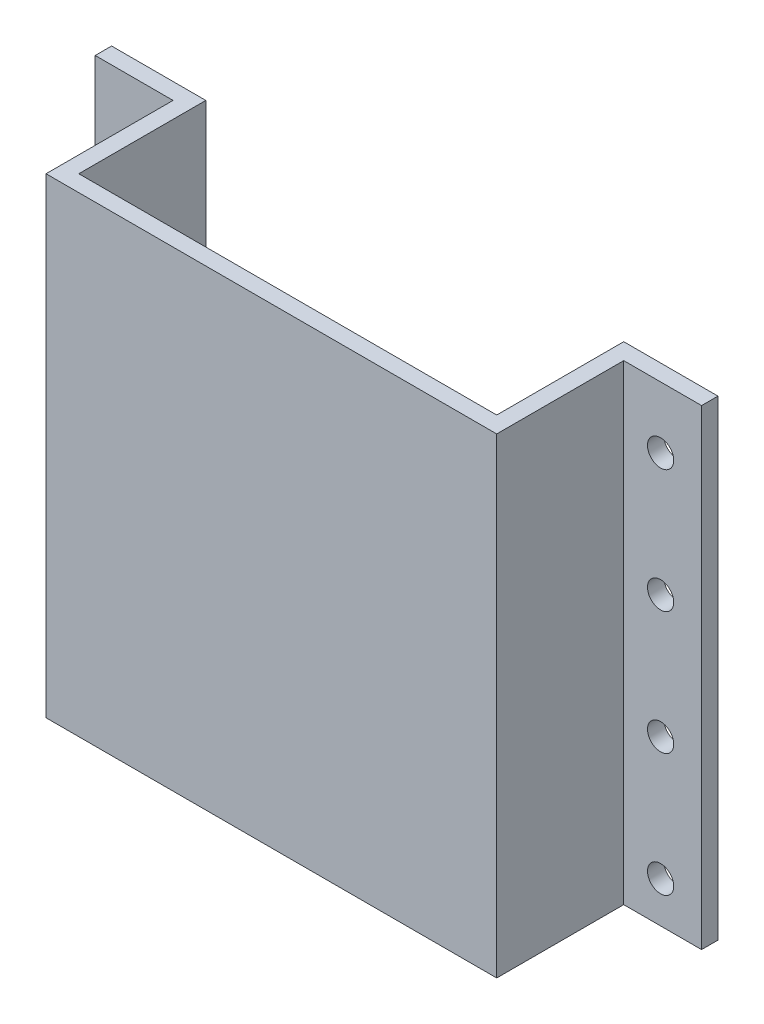
ISO-10303-21;
HEADER;
FILE_DESCRIPTION(('STEP AP214'),'2;1');
FILE_NAME('part.step','',(''),(''),'','','');
FILE_SCHEMA(('AUTOMOTIVE_DESIGN { 1 0 10303 214 1 1 1 1 }'));
ENDSEC;
DATA;
#1=APPLICATION_CONTEXT('core data for automotive mechanical design processes');
#2=APPLICATION_PROTOCOL_DEFINITION('international standard','automotive_design',2000,#1);
#3=PRODUCT_CONTEXT('',#1,'mechanical');
#4=PRODUCT('Part','Part','',(#3));
#5=PRODUCT_RELATED_PRODUCT_CATEGORY('part','',(#4));
#6=PRODUCT_DEFINITION_FORMATION('','',#4);
#7=PRODUCT_DEFINITION_CONTEXT('part definition',#1,'design');
#8=PRODUCT_DEFINITION('design','',#6,#7);
#9=PRODUCT_DEFINITION_SHAPE('','',#8);
#10=(LENGTH_UNIT() NAMED_UNIT(*) SI_UNIT(.MILLI.,.METRE.));
#11=(NAMED_UNIT(*) PLANE_ANGLE_UNIT() SI_UNIT($,.RADIAN.));
#12=(NAMED_UNIT(*) SI_UNIT($,.STERADIAN.) SOLID_ANGLE_UNIT());
#13=UNCERTAINTY_MEASURE_WITH_UNIT(LENGTH_MEASURE(1.E-05),#10,'distance_accuracy_value','');
#14=(GEOMETRIC_REPRESENTATION_CONTEXT(3) GLOBAL_UNCERTAINTY_ASSIGNED_CONTEXT((#13)) GLOBAL_UNIT_ASSIGNED_CONTEXT((#10,
#11,#12)) REPRESENTATION_CONTEXT('',''));
#15=CARTESIAN_POINT('',(0.,0.,0.));
#16=DIRECTION('',(0.,0.,1.));
#17=DIRECTION('',(1.,0.,0.));
#18=AXIS2_PLACEMENT_3D('',#15,#16,#17);
#19=CARTESIAN_POINT('',(4.45197740112994,70.,0.));
#20=DIRECTION('',(1.,0.,0.));
#21=DIRECTION('',(0.,0.,-1.));
#22=AXIS2_PLACEMENT_3D('',#19,#20,#21);
#23=PLANE('',#22);
#24=DIRECTION('',(0.,0.,1.));
#25=VECTOR('',#24,1.);
#26=CARTESIAN_POINT('',(4.45197740112994,57.5,0.));
#27=LINE('',#26,#25);
#28=CARTESIAN_POINT('',(4.45197740112994,57.5,0.));
#29=VERTEX_POINT('',#28);
#30=CARTESIAN_POINT('',(4.45197740112995,57.5,15.5));
#31=VERTEX_POINT('',#30);
#32=EDGE_CURVE('E126',#29,#31,#27,.T.);
#33=ORIENTED_EDGE('',*,*,#32,.F.);
#34=DIRECTION('',(0.,-1.,0.));
#35=VECTOR('',#34,1.);
#36=CARTESIAN_POINT('',(4.45197740112994,70.,0.));
#37=LINE('',#36,#35);
#38=CARTESIAN_POINT('',(4.45197740112994,0.,0.));
#39=VERTEX_POINT('',#38);
#40=EDGE_CURVE('E139',#29,#39,#37,.T.);
#41=ORIENTED_EDGE('',*,*,#40,.T.);
#42=DIRECTION('',(0.,0.,1.));
#43=VECTOR('',#42,1.);
#44=CARTESIAN_POINT('',(4.45197740112994,0.,0.));
#45=LINE('',#44,#43);
#46=CARTESIAN_POINT('',(4.45197740112995,0.,15.5));
#47=VERTEX_POINT('',#46);
#48=EDGE_CURVE('E198',#39,#47,#45,.T.);
#49=ORIENTED_EDGE('',*,*,#48,.T.);
#50=DIRECTION('',(0.,-1.,0.));
#51=VECTOR('',#50,1.);
#52=CARTESIAN_POINT('',(4.45197740112995,70.,15.5));
#53=LINE('',#52,#51);
#54=EDGE_CURVE('E48',#31,#47,#53,.T.);
#55=ORIENTED_EDGE('',*,*,#54,.F.);
#56=EDGE_LOOP('',(#33,#41,#49,#55));
#57=FACE_BOUND('',#56,.T.);
#58=ADVANCED_FACE('F41',(#57),#23,.F.);
#59=CARTESIAN_POINT('',(4.45197740112995,70.,15.5));
#60=DIRECTION('',(0.,0.,-1.));
#61=DIRECTION('',(-1.,0.,0.));
#62=AXIS2_PLACEMENT_3D('',#59,#60,#61);
#63=PLANE('',#62);
#64=DIRECTION('',(1.,0.,0.));
#65=VECTOR('',#64,1.);
#66=CARTESIAN_POINT('',(4.45197740112995,57.5,15.5));
#67=LINE('',#66,#65);
#68=CARTESIAN_POINT('',(59.4519774011299,57.5,15.5));
#69=VERTEX_POINT('',#68);
#70=EDGE_CURVE('E229',#31,#69,#67,.T.);
#71=ORIENTED_EDGE('',*,*,#70,.F.);
#72=ORIENTED_EDGE('',*,*,#54,.T.);
#73=DIRECTION('',(1.,0.,0.));
#74=VECTOR('',#73,1.);
#75=CARTESIAN_POINT('',(4.45197740112995,0.,15.5));
#76=LINE('',#75,#74);
#77=CARTESIAN_POINT('',(59.4519774011299,0.,15.5));
#78=VERTEX_POINT('',#77);
#79=EDGE_CURVE('E204',#47,#78,#76,.T.);
#80=ORIENTED_EDGE('',*,*,#79,.T.);
#81=DIRECTION('',(0.,-1.,0.));
#82=VECTOR('',#81,1.);
#83=CARTESIAN_POINT('',(59.4519774011299,70.,15.5));
#84=LINE('',#83,#82);
#85=EDGE_CURVE('E166',#69,#78,#84,.T.);
#86=ORIENTED_EDGE('',*,*,#85,.F.);
#87=EDGE_LOOP('',(#71,#72,#80,#86));
#88=FACE_BOUND('',#87,.T.);
#89=ADVANCED_FACE('F230',(#88),#63,.F.);
#90=CARTESIAN_POINT('',(59.4519774011299,70.,15.5));
#91=DIRECTION('',(-1.,0.,0.));
#92=DIRECTION('',(0.,0.,1.));
#93=AXIS2_PLACEMENT_3D('',#90,#91,#92);
#94=PLANE('',#93);
#95=DIRECTION('',(0.,0.,-1.));
#96=VECTOR('',#95,1.);
#97=CARTESIAN_POINT('',(59.4519774011299,57.5,15.5));
#98=LINE('',#97,#96);
#99=CARTESIAN_POINT('',(59.4519774011299,57.5,0.));
#100=VERTEX_POINT('',#99);
#101=EDGE_CURVE('E231',#69,#100,#98,.T.);
#102=ORIENTED_EDGE('',*,*,#101,.F.);
#103=ORIENTED_EDGE('',*,*,#85,.T.);
#104=DIRECTION('',(0.,0.,-1.));
#105=VECTOR('',#104,1.);
#106=CARTESIAN_POINT('',(59.4519774011299,0.,15.5));
#107=LINE('',#106,#105);
#108=CARTESIAN_POINT('',(59.4519774011299,0.,0.));
#109=VERTEX_POINT('',#108);
#110=EDGE_CURVE('E203',#78,#109,#107,.T.);
#111=ORIENTED_EDGE('',*,*,#110,.T.);
#112=DIRECTION('',(0.,-1.,0.));
#113=VECTOR('',#112,1.);
#114=CARTESIAN_POINT('',(59.4519774011299,70.,0.));
#115=LINE('',#114,#113);
#116=EDGE_CURVE('E168',#100,#109,#115,.T.);
#117=ORIENTED_EDGE('',*,*,#116,.F.);
#118=EDGE_LOOP('',(#102,#103,#111,#117));
#119=FACE_BOUND('',#118,.T.);
#120=ADVANCED_FACE('F300',(#119),#94,.F.);
#121=CARTESIAN_POINT('',(59.4519774011299,70.,0.));
#122=DIRECTION('',(0.,0.,-1.));
#123=DIRECTION('',(-1.,0.,0.));
#124=AXIS2_PLACEMENT_3D('',#121,#122,#123);
#125=PLANE('',#124);
#126=CARTESIAN_POINT('',(63.95197740113,35.,0.));
#127=DIRECTION('',(0.,0.,1.));
#128=DIRECTION('',(-1.,0.,0.));
#129=AXIS2_PLACEMENT_3D('',#126,#127,#128);
#130=CIRCLE('',#129,1.60000000000001);
#131=CARTESIAN_POINT('',(62.35197740113,35.,0.));
#132=VERTEX_POINT('',#131);
#133=EDGE_CURVE('E235',#132,#132,#130,.T.);
#134=ORIENTED_EDGE('',*,*,#133,.F.);
#135=EDGE_LOOP('',(#134));
#136=FACE_BOUND('',#135,.T.);
#137=CARTESIAN_POINT('',(63.9519774011299,20.,0.));
#138=DIRECTION('',(0.,0.,1.));
#139=DIRECTION('',(-1.,0.,0.));
#140=AXIS2_PLACEMENT_3D('',#137,#138,#139);
#141=CIRCLE('',#140,1.6);
#142=CARTESIAN_POINT('',(62.3519774011299,20.,0.));
#143=VERTEX_POINT('',#142);
#144=EDGE_CURVE('E236',#143,#143,#141,.T.);
#145=ORIENTED_EDGE('',*,*,#144,.F.);
#146=EDGE_LOOP('',(#145));
#147=FACE_BOUND('',#146,.T.);
#148=CARTESIAN_POINT('',(63.95197740113,5.,0.));
#149=DIRECTION('',(0.,0.,1.));
#150=DIRECTION('',(-1.,0.,0.));
#151=AXIS2_PLACEMENT_3D('',#148,#149,#150);
#152=CIRCLE('',#151,1.60000000000001);
#153=CARTESIAN_POINT('',(62.35197740113,5.,0.));
#154=VERTEX_POINT('',#153);
#155=EDGE_CURVE('E253',#154,#154,#152,.T.);
#156=ORIENTED_EDGE('',*,*,#155,.F.);
#157=EDGE_LOOP('',(#156));
#158=FACE_BOUND('',#157,.T.);
#159=CARTESIAN_POINT('',(63.9519774011299,50.,0.));
#160=DIRECTION('',(0.,0.,1.));
#161=DIRECTION('',(1.,0.,0.));
#162=AXIS2_PLACEMENT_3D('',#159,#160,#161);
#163=CIRCLE('',#162,1.60000000000001);
#164=CARTESIAN_POINT('',(65.5519774011299,50.,0.));
#165=VERTEX_POINT('',#164);
#166=EDGE_CURVE('E255',#165,#165,#163,.T.);
#167=ORIENTED_EDGE('',*,*,#166,.F.);
#168=EDGE_LOOP('',(#167));
#169=FACE_BOUND('',#168,.T.);
#170=DIRECTION('',(1.,0.,0.));
#171=VECTOR('',#170,1.);
#172=CARTESIAN_POINT('',(59.4519774011299,57.5,0.));
#173=LINE('',#172,#171);
#174=CARTESIAN_POINT('',(68.95197740113,57.5,0.));
#175=VERTEX_POINT('',#174);
#176=EDGE_CURVE('E238',#100,#175,#173,.T.);
#177=ORIENTED_EDGE('',*,*,#176,.F.);
#178=ORIENTED_EDGE('',*,*,#116,.T.);
#179=DIRECTION('',(1.,0.,0.));
#180=VECTOR('',#179,1.);
#181=CARTESIAN_POINT('',(59.4519774011299,0.,0.));
#182=LINE('',#181,#180);
#183=CARTESIAN_POINT('',(68.95197740113,0.,0.));
#184=VERTEX_POINT('',#183);
#185=EDGE_CURVE('E206',#109,#184,#182,.T.);
#186=ORIENTED_EDGE('',*,*,#185,.T.);
#187=DIRECTION('',(0.,-1.,0.));
#188=VECTOR('',#187,1.);
#189=CARTESIAN_POINT('',(68.95197740113,70.,0.));
#190=LINE('',#189,#188);
#191=EDGE_CURVE('E165',#175,#184,#190,.T.);
#192=ORIENTED_EDGE('',*,*,#191,.F.);
#193=EDGE_LOOP('',(#177,#178,#186,#192));
#194=FACE_BOUND('',#193,.T.);
#195=ADVANCED_FACE('F301',(#136,#147,#158,#169,#194),#125,.F.);
#196=CARTESIAN_POINT('',(68.95197740113,70.,0.));
#197=DIRECTION('',(-1.,0.,0.));
#198=DIRECTION('',(0.,0.,1.));
#199=AXIS2_PLACEMENT_3D('',#196,#197,#198);
#200=PLANE('',#199);
#201=DIRECTION('',(0.,0.,-1.));
#202=VECTOR('',#201,1.);
#203=CARTESIAN_POINT('',(68.95197740113,57.5,0.));
#204=LINE('',#203,#202);
#205=CARTESIAN_POINT('',(68.95197740113,57.5,-2.00000000000001));
#206=VERTEX_POINT('',#205);
#207=EDGE_CURVE('E369',#175,#206,#204,.T.);
#208=ORIENTED_EDGE('',*,*,#207,.F.);
#209=ORIENTED_EDGE('',*,*,#191,.T.);
#210=DIRECTION('',(0.,0.,-1.));
#211=VECTOR('',#210,1.);
#212=CARTESIAN_POINT('',(68.95197740113,0.,0.));
#213=LINE('',#212,#211);
#214=CARTESIAN_POINT('',(68.95197740113,0.,-2.00000000000001));
#215=VERTEX_POINT('',#214);
#216=EDGE_CURVE('E212',#184,#215,#213,.T.);
#217=ORIENTED_EDGE('',*,*,#216,.T.);
#218=DIRECTION('',(0.,-1.,0.));
#219=VECTOR('',#218,1.);
#220=CARTESIAN_POINT('',(68.95197740113,70.,-2.00000000000001));
#221=LINE('',#220,#219);
#222=EDGE_CURVE('E162',#206,#215,#221,.T.);
#223=ORIENTED_EDGE('',*,*,#222,.F.);
#224=EDGE_LOOP('',(#208,#209,#217,#223));
#225=FACE_BOUND('',#224,.T.);
#226=ADVANCED_FACE('F310',(#225),#200,.F.);
#227=CARTESIAN_POINT('',(57.4519774011299,70.,-2.00000000000001));
#228=DIRECTION('',(1.,0.,0.));
#229=DIRECTION('',(0.,0.,-1.));
#230=AXIS2_PLACEMENT_3D('',#227,#228,#229);
#231=PLANE('',#230);
#232=DIRECTION('',(0.,0.,1.));
#233=VECTOR('',#232,1.);
#234=CARTESIAN_POINT('',(57.4519774011299,57.5,-2.00000000000001));
#235=LINE('',#234,#233);
#236=CARTESIAN_POINT('',(57.4519774011299,57.5,-2.00000000000001));
#237=VERTEX_POINT('',#236);
#238=CARTESIAN_POINT('',(57.4519774011299,57.5,13.5));
#239=VERTEX_POINT('',#238);
#240=EDGE_CURVE('E138',#237,#239,#235,.T.);
#241=ORIENTED_EDGE('',*,*,#240,.F.);
#242=DIRECTION('',(0.,-1.,0.));
#243=VECTOR('',#242,1.);
#244=CARTESIAN_POINT('',(57.4519774011299,70.,-2.00000000000001));
#245=LINE('',#244,#243);
#246=CARTESIAN_POINT('',(57.4519774011299,5.,-2.00000000000001));
#247=VERTEX_POINT('',#246);
#248=EDGE_CURVE('E158',#237,#247,#245,.T.);
#249=ORIENTED_EDGE('',*,*,#248,.T.);
#250=DIRECTION('',(0.,0.,1.));
#251=VECTOR('',#250,1.);
#252=CARTESIAN_POINT('',(57.4519774011299,5.,13.5));
#253=LINE('',#252,#251);
#254=CARTESIAN_POINT('',(57.4519774011299,5.,13.5));
#255=VERTEX_POINT('',#254);
#256=EDGE_CURVE('E188',#247,#255,#253,.T.);
#257=ORIENTED_EDGE('',*,*,#256,.T.);
#258=DIRECTION('',(0.,-1.,0.));
#259=VECTOR('',#258,1.);
#260=CARTESIAN_POINT('',(57.4519774011299,70.,13.5));
#261=LINE('',#260,#259);
#262=EDGE_CURVE('E160',#239,#255,#261,.T.);
#263=ORIENTED_EDGE('',*,*,#262,.F.);
#264=EDGE_LOOP('',(#241,#249,#257,#263));
#265=FACE_BOUND('',#264,.T.);
#266=ADVANCED_FACE('F311',(#265),#231,.F.);
#267=CARTESIAN_POINT('',(57.4519774011299,70.,13.5));
#268=DIRECTION('',(0.,0.,1.));
#269=DIRECTION('',(1.,0.,0.));
#270=AXIS2_PLACEMENT_3D('',#267,#268,#269);
#271=PLANE('',#270);
#272=DIRECTION('',(-1.,0.,0.));
#273=VECTOR('',#272,1.);
#274=CARTESIAN_POINT('',(57.4519774011299,57.5,13.5));
#275=LINE('',#274,#273);
#276=CARTESIAN_POINT('',(6.45197740112994,57.5,13.5));
#277=VERTEX_POINT('',#276);
#278=EDGE_CURVE('E378',#239,#277,#275,.T.);
#279=ORIENTED_EDGE('',*,*,#278,.F.);
#280=ORIENTED_EDGE('',*,*,#262,.T.);
#281=DIRECTION('',(-1.,0.,0.));
#282=VECTOR('',#281,1.);
#283=CARTESIAN_POINT('',(6.45197740112994,5.,13.5));
#284=LINE('',#283,#282);
#285=CARTESIAN_POINT('',(6.45197740112994,5.,13.5));
#286=VERTEX_POINT('',#285);
#287=EDGE_CURVE('E199',#255,#286,#284,.T.);
#288=ORIENTED_EDGE('',*,*,#287,.T.);
#289=DIRECTION('',(0.,-1.,0.));
#290=VECTOR('',#289,1.);
#291=CARTESIAN_POINT('',(6.45197740112994,70.,13.5));
#292=LINE('',#291,#290);
#293=EDGE_CURVE('E157',#277,#286,#292,.T.);
#294=ORIENTED_EDGE('',*,*,#293,.F.);
#295=EDGE_LOOP('',(#279,#280,#288,#294));
#296=FACE_BOUND('',#295,.T.);
#297=ADVANCED_FACE('F314',(#296),#271,.F.);
#298=CARTESIAN_POINT('',(6.45197740112994,70.,13.5));
#299=DIRECTION('',(-1.,0.,0.));
#300=DIRECTION('',(0.,0.,1.));
#301=AXIS2_PLACEMENT_3D('',#298,#299,#300);
#302=PLANE('',#301);
#303=DIRECTION('',(0.,0.,-1.));
#304=VECTOR('',#303,1.);
#305=CARTESIAN_POINT('',(6.45197740112994,57.5,13.5));
#306=LINE('',#305,#304);
#307=CARTESIAN_POINT('',(6.45197740112994,57.5,-2.));
#308=VERTEX_POINT('',#307);
#309=EDGE_CURVE('E376',#277,#308,#306,.T.);
#310=ORIENTED_EDGE('',*,*,#309,.F.);
#311=ORIENTED_EDGE('',*,*,#293,.T.);
#312=DIRECTION('',(0.,0.,-1.));
#313=VECTOR('',#312,1.);
#314=CARTESIAN_POINT('',(6.45197740112994,5.,13.5));
#315=LINE('',#314,#313);
#316=CARTESIAN_POINT('',(6.45197740112994,5.,-2.));
#317=VERTEX_POINT('',#316);
#318=EDGE_CURVE('E185',#286,#317,#315,.T.);
#319=ORIENTED_EDGE('',*,*,#318,.T.);
#320=DIRECTION('',(0.,-1.,0.));
#321=VECTOR('',#320,1.);
#322=CARTESIAN_POINT('',(6.45197740112994,70.,-2.));
#323=LINE('',#322,#321);
#324=EDGE_CURVE('E65',#308,#317,#323,.T.);
#325=ORIENTED_EDGE('',*,*,#324,.F.);
#326=EDGE_LOOP('',(#310,#311,#319,#325));
#327=FACE_BOUND('',#326,.T.);
#328=ADVANCED_FACE('F316',(#327),#302,.F.);
#329=CARTESIAN_POINT('',(6.45197740112994,70.,-2.));
#330=DIRECTION('',(0.,0.,1.));
#331=DIRECTION('',(1.,0.,0.));
#332=AXIS2_PLACEMENT_3D('',#329,#330,#331);
#333=PLANE('',#332);
#334=CARTESIAN_POINT('',(-0.0480225988700511,20.,-2.));
#335=DIRECTION('',(0.,0.,1.));
#336=DIRECTION('',(1.,0.,0.));
#337=AXIS2_PLACEMENT_3D('',#334,#335,#336);
#338=CIRCLE('',#337,1.6);
#339=CARTESIAN_POINT('',(1.55197740112995,20.,-2.));
#340=VERTEX_POINT('',#339);
#341=EDGE_CURVE('E174',#340,#340,#338,.T.);
#342=ORIENTED_EDGE('',*,*,#341,.T.);
#343=EDGE_LOOP('',(#342));
#344=FACE_BOUND('',#343,.T.);
#345=CARTESIAN_POINT('',(-0.0480225988700504,5.00000000000001,-2.));
#346=DIRECTION('',(0.,0.,1.));
#347=DIRECTION('',(1.,0.,0.));
#348=AXIS2_PLACEMENT_3D('',#345,#346,#347);
#349=CIRCLE('',#348,1.6);
#350=CARTESIAN_POINT('',(1.55197740112995,5.00000000000001,-2.));
#351=VERTEX_POINT('',#350);
#352=EDGE_CURVE('E269',#351,#351,#349,.T.);
#353=ORIENTED_EDGE('',*,*,#352,.T.);
#354=EDGE_LOOP('',(#353));
#355=FACE_BOUND('',#354,.T.);
#356=CARTESIAN_POINT('',(-0.0480225988700548,50.,-2.));
#357=DIRECTION('',(0.,0.,1.));
#358=DIRECTION('',(1.,0.,0.));
#359=AXIS2_PLACEMENT_3D('',#356,#357,#358);
#360=CIRCLE('',#359,1.6);
#361=CARTESIAN_POINT('',(1.55197740112994,50.,-2.));
#362=VERTEX_POINT('',#361);
#363=EDGE_CURVE('E263',#362,#362,#360,.T.);
#364=ORIENTED_EDGE('',*,*,#363,.T.);
#365=EDGE_LOOP('',(#364));
#366=FACE_BOUND('',#365,.T.);
#367=CARTESIAN_POINT('',(63.9519774011299,50.,-2.00000000000001));
#368=DIRECTION('',(0.,0.,1.));
#369=DIRECTION('',(1.,0.,0.));
#370=AXIS2_PLACEMENT_3D('',#367,#368,#369);
#371=CIRCLE('',#370,1.60000000000001);
#372=CARTESIAN_POINT('',(65.5519774011299,50.,-2.00000000000001));
#373=VERTEX_POINT('',#372);
#374=EDGE_CURVE('E179',#373,#373,#371,.T.);
#375=ORIENTED_EDGE('',*,*,#374,.T.);
#376=EDGE_LOOP('',(#375));
#377=FACE_BOUND('',#376,.T.);
#378=CARTESIAN_POINT('',(63.95197740113,5.,-2.00000000000001));
#379=DIRECTION('',(0.,0.,1.));
#380=DIRECTION('',(1.,0.,0.));
#381=AXIS2_PLACEMENT_3D('',#378,#379,#380);
#382=CIRCLE('',#381,1.60000000000001);
#383=CARTESIAN_POINT('',(65.55197740113,5.,-2.00000000000001));
#384=VERTEX_POINT('',#383);
#385=EDGE_CURVE('E178',#384,#384,#382,.T.);
#386=ORIENTED_EDGE('',*,*,#385,.T.);
#387=EDGE_LOOP('',(#386));
#388=FACE_BOUND('',#387,.T.);
#389=CARTESIAN_POINT('',(63.9519774011299,20.,-2.00000000000001));
#390=DIRECTION('',(0.,0.,1.));
#391=DIRECTION('',(1.,0.,0.));
#392=AXIS2_PLACEMENT_3D('',#389,#390,#391);
#393=CIRCLE('',#392,1.6);
#394=CARTESIAN_POINT('',(65.5519774011299,20.,-2.00000000000001));
#395=VERTEX_POINT('',#394);
#396=EDGE_CURVE('E172',#395,#395,#393,.T.);
#397=ORIENTED_EDGE('',*,*,#396,.T.);
#398=EDGE_LOOP('',(#397));
#399=FACE_BOUND('',#398,.T.);
#400=CARTESIAN_POINT('',(63.95197740113,35.,-2.00000000000001));
#401=DIRECTION('',(0.,0.,1.));
#402=DIRECTION('',(1.,0.,0.));
#403=AXIS2_PLACEMENT_3D('',#400,#401,#402);
#404=CIRCLE('',#403,1.60000000000001);
#405=CARTESIAN_POINT('',(65.55197740113,35.,-2.00000000000001));
#406=VERTEX_POINT('',#405);
#407=EDGE_CURVE('E171',#406,#406,#404,.T.);
#408=ORIENTED_EDGE('',*,*,#407,.T.);
#409=EDGE_LOOP('',(#408));
#410=FACE_BOUND('',#409,.T.);
#411=CARTESIAN_POINT('',(-0.0480225988700612,35.,-2.));
#412=DIRECTION('',(0.,0.,1.));
#413=DIRECTION('',(1.,0.,0.));
#414=AXIS2_PLACEMENT_3D('',#411,#412,#413);
#415=CIRCLE('',#414,1.6);
#416=CARTESIAN_POINT('',(1.55197740112994,35.,-2.));
#417=VERTEX_POINT('',#416);
#418=EDGE_CURVE('E264',#417,#417,#415,.T.);
#419=ORIENTED_EDGE('',*,*,#418,.T.);
#420=EDGE_LOOP('',(#419));
#421=FACE_BOUND('',#420,.T.);
#422=DIRECTION('',(-1.,0.,0.));
#423=VECTOR('',#422,1.);
#424=CARTESIAN_POINT('',(6.45197740112994,57.5,-2.));
#425=LINE('',#424,#423);
#426=EDGE_CURVE('E136',#206,#237,#425,.T.);
#427=ORIENTED_EDGE('',*,*,#426,.F.);
#428=ORIENTED_EDGE('',*,*,#222,.T.);
#429=DIRECTION('',(-1.,0.,0.));
#430=VECTOR('',#429,1.);
#431=CARTESIAN_POINT('',(6.45197740112994,0.,-2.));
#432=LINE('',#431,#430);
#433=CARTESIAN_POINT('',(-5.04802259887006,0.,-2.));
#434=VERTEX_POINT('',#433);
#435=EDGE_CURVE('E211',#215,#434,#432,.T.);
#436=ORIENTED_EDGE('',*,*,#435,.T.);
#437=DIRECTION('',(0.,-1.,0.));
#438=VECTOR('',#437,1.);
#439=CARTESIAN_POINT('',(-5.04802259887006,70.,-2.));
#440=LINE('',#439,#438);
#441=CARTESIAN_POINT('',(-5.04802259887006,57.5,-2.));
#442=VERTEX_POINT('',#441);
#443=EDGE_CURVE('E149',#442,#434,#440,.T.);
#444=ORIENTED_EDGE('',*,*,#443,.F.);
#445=EDGE_CURVE('E375',#308,#442,#425,.T.);
#446=ORIENTED_EDGE('',*,*,#445,.F.);
#447=ORIENTED_EDGE('',*,*,#324,.T.);
#448=DIRECTION('',(1.,0.,0.));
#449=VECTOR('',#448,1.);
#450=CARTESIAN_POINT('',(6.45197740112995,5.,-2.00000000000001));
#451=LINE('',#450,#449);
#452=EDGE_CURVE('E187',#317,#247,#451,.T.);
#453=ORIENTED_EDGE('',*,*,#452,.T.);
#454=ORIENTED_EDGE('',*,*,#248,.F.);
#455=EDGE_LOOP('',(#427,#428,#436,#444,#446,#447,#453,#454));
#456=FACE_BOUND('',#455,.T.);
#457=ADVANCED_FACE('F274',(#344,#355,#366,#377,#388,#399,#410,#421,#456),#333,.F.);
#458=CARTESIAN_POINT('',(-5.04802259887006,70.,-2.));
#459=DIRECTION('',(1.,0.,0.));
#460=DIRECTION('',(0.,0.,-1.));
#461=AXIS2_PLACEMENT_3D('',#458,#459,#460);
#462=PLANE('',#461);
#463=DIRECTION('',(0.,0.,1.));
#464=VECTOR('',#463,1.);
#465=CARTESIAN_POINT('',(-5.04802259887006,57.5,-2.));
#466=LINE('',#465,#464);
#467=CARTESIAN_POINT('',(-5.04802259887006,57.5,0.));
#468=VERTEX_POINT('',#467);
#469=EDGE_CURVE('E53',#442,#468,#466,.T.);
#470=ORIENTED_EDGE('',*,*,#469,.F.);
#471=ORIENTED_EDGE('',*,*,#443,.T.);
#472=DIRECTION('',(0.,0.,1.));
#473=VECTOR('',#472,1.);
#474=CARTESIAN_POINT('',(-5.04802259887006,0.,-2.));
#475=LINE('',#474,#473);
#476=CARTESIAN_POINT('',(-5.04802259887006,0.,0.));
#477=VERTEX_POINT('',#476);
#478=EDGE_CURVE('E148',#434,#477,#475,.T.);
#479=ORIENTED_EDGE('',*,*,#478,.T.);
#480=DIRECTION('',(0.,-1.,0.));
#481=VECTOR('',#480,1.);
#482=CARTESIAN_POINT('',(-5.04802259887006,70.,0.));
#483=LINE('',#482,#481);
#484=EDGE_CURVE('E147',#468,#477,#483,.T.);
#485=ORIENTED_EDGE('',*,*,#484,.F.);
#486=EDGE_LOOP('',(#470,#471,#479,#485));
#487=FACE_BOUND('',#486,.T.);
#488=ADVANCED_FACE('F216',(#487),#462,.F.);
#489=CARTESIAN_POINT('',(-5.04802259887006,70.,0.));
#490=DIRECTION('',(0.,0.,-1.));
#491=DIRECTION('',(-1.,0.,0.));
#492=AXIS2_PLACEMENT_3D('',#489,#490,#491);
#493=PLANE('',#492);
#494=CARTESIAN_POINT('',(-0.0480225988700612,35.,0.));
#495=DIRECTION('',(0.,0.,1.));
#496=DIRECTION('',(1.,0.,0.));
#497=AXIS2_PLACEMENT_3D('',#494,#495,#496);
#498=CIRCLE('',#497,1.6);
#499=CARTESIAN_POINT('',(1.55197740112994,35.,0.));
#500=VERTEX_POINT('',#499);
#501=EDGE_CURVE('E244',#500,#500,#498,.T.);
#502=ORIENTED_EDGE('',*,*,#501,.F.);
#503=EDGE_LOOP('',(#502));
#504=FACE_BOUND('',#503,.T.);
#505=CARTESIAN_POINT('',(-0.0480225988700548,50.,0.));
#506=DIRECTION('',(0.,0.,1.));
#507=DIRECTION('',(-1.,0.,0.));
#508=AXIS2_PLACEMENT_3D('',#505,#506,#507);
#509=CIRCLE('',#508,1.6);
#510=CARTESIAN_POINT('',(-1.64802259887005,50.,0.));
#511=VERTEX_POINT('',#510);
#512=EDGE_CURVE('E248',#511,#511,#509,.T.);
#513=ORIENTED_EDGE('',*,*,#512,.F.);
#514=EDGE_LOOP('',(#513));
#515=FACE_BOUND('',#514,.T.);
#516=CARTESIAN_POINT('',(-0.0480225988700504,5.00000000000001,0.));
#517=DIRECTION('',(0.,0.,1.));
#518=DIRECTION('',(1.,0.,0.));
#519=AXIS2_PLACEMENT_3D('',#516,#517,#518);
#520=CIRCLE('',#519,1.6);
#521=CARTESIAN_POINT('',(1.55197740112995,5.00000000000001,0.));
#522=VERTEX_POINT('',#521);
#523=EDGE_CURVE('E246',#522,#522,#520,.T.);
#524=ORIENTED_EDGE('',*,*,#523,.F.);
#525=EDGE_LOOP('',(#524));
#526=FACE_BOUND('',#525,.T.);
#527=CARTESIAN_POINT('',(-0.0480225988700511,20.,0.));
#528=DIRECTION('',(0.,0.,1.));
#529=DIRECTION('',(1.,0.,0.));
#530=AXIS2_PLACEMENT_3D('',#527,#528,#529);
#531=CIRCLE('',#530,1.6);
#532=CARTESIAN_POINT('',(1.55197740112995,20.,0.));
#533=VERTEX_POINT('',#532);
#534=EDGE_CURVE('E245',#533,#533,#531,.T.);
#535=ORIENTED_EDGE('',*,*,#534,.F.);
#536=EDGE_LOOP('',(#535));
#537=FACE_BOUND('',#536,.T.);
#538=DIRECTION('',(1.,0.,0.));
#539=VECTOR('',#538,1.);
#540=CARTESIAN_POINT('',(-5.04802259887006,57.5,0.));
#541=LINE('',#540,#539);
#542=EDGE_CURVE('E11',#468,#29,#541,.T.);
#543=ORIENTED_EDGE('',*,*,#542,.F.);
#544=ORIENTED_EDGE('',*,*,#484,.T.);
#545=DIRECTION('',(1.,0.,0.));
#546=VECTOR('',#545,1.);
#547=CARTESIAN_POINT('',(-5.04802259887006,0.,0.));
#548=LINE('',#547,#546);
#549=EDGE_CURVE('E144',#477,#39,#548,.T.);
#550=ORIENTED_EDGE('',*,*,#549,.T.);
#551=ORIENTED_EDGE('',*,*,#40,.F.);
#552=EDGE_LOOP('',(#543,#544,#550,#551));
#553=FACE_BOUND('',#552,.T.);
#554=ADVANCED_FACE('F145',(#504,#515,#526,#537,#553),#493,.F.);
#555=CARTESIAN_POINT('',(0.,0.,0.));
#556=DIRECTION('',(0.,1.,0.));
#557=DIRECTION('',(0.,0.,1.));
#558=AXIS2_PLACEMENT_3D('',#555,#556,#557);
#559=PLANE('',#558);
#560=ORIENTED_EDGE('',*,*,#48,.F.);
#561=ORIENTED_EDGE('',*,*,#549,.F.);
#562=ORIENTED_EDGE('',*,*,#478,.F.);
#563=ORIENTED_EDGE('',*,*,#435,.F.);
#564=ORIENTED_EDGE('',*,*,#216,.F.);
#565=ORIENTED_EDGE('',*,*,#185,.F.);
#566=ORIENTED_EDGE('',*,*,#110,.F.);
#567=ORIENTED_EDGE('',*,*,#79,.F.);
#568=EDGE_LOOP('',(#560,#561,#562,#563,#564,#565,#566,#567));
#569=FACE_BOUND('',#568,.T.);
#570=ADVANCED_FACE('F225',(#569),#559,.F.);
#571=CARTESIAN_POINT('',(0.,5.,0.));
#572=DIRECTION('',(0.,-1.,0.));
#573=DIRECTION('',(0.,0.,-1.));
#574=AXIS2_PLACEMENT_3D('',#571,#572,#573);
#575=PLANE('',#574);
#576=ORIENTED_EDGE('',*,*,#318,.F.);
#577=ORIENTED_EDGE('',*,*,#287,.F.);
#578=ORIENTED_EDGE('',*,*,#256,.F.);
#579=ORIENTED_EDGE('',*,*,#452,.F.);
#580=EDGE_LOOP('',(#576,#577,#578,#579));
#581=FACE_BOUND('',#580,.T.);
#582=ADVANCED_FACE('F334',(#581),#575,.F.);
#583=CARTESIAN_POINT('',(-0.0480225988700612,35.,-17.));
#584=DIRECTION('',(0.,0.,1.));
#585=DIRECTION('',(1.,0.,0.));
#586=AXIS2_PLACEMENT_3D('',#583,#584,#585);
#587=CYLINDRICAL_SURFACE('',#586,1.6);
#588=ORIENTED_EDGE('',*,*,#501,.T.);
#589=EDGE_LOOP('',(#588));
#590=FACE_BOUND('',#589,.T.);
#591=ORIENTED_EDGE('',*,*,#418,.F.);
#592=EDGE_LOOP('',(#591));
#593=FACE_BOUND('',#592,.T.);
#594=ADVANCED_FACE('F333',(#590,#593),#587,.F.);
#595=CARTESIAN_POINT('',(-0.0480225988700548,50.,-17.));
#596=DIRECTION('',(0.,0.,1.));
#597=DIRECTION('',(1.,0.,0.));
#598=AXIS2_PLACEMENT_3D('',#595,#596,#597);
#599=CYLINDRICAL_SURFACE('',#598,1.6);
#600=ORIENTED_EDGE('',*,*,#512,.T.);
#601=EDGE_LOOP('',(#600));
#602=FACE_BOUND('',#601,.T.);
#603=ORIENTED_EDGE('',*,*,#363,.F.);
#604=EDGE_LOOP('',(#603));
#605=FACE_BOUND('',#604,.T.);
#606=ADVANCED_FACE('F286',(#602,#605),#599,.F.);
#607=CARTESIAN_POINT('',(-0.0480225988700504,5.00000000000001,-17.));
#608=DIRECTION('',(0.,0.,1.));
#609=DIRECTION('',(1.,0.,0.));
#610=AXIS2_PLACEMENT_3D('',#607,#608,#609);
#611=CYLINDRICAL_SURFACE('',#610,1.6);
#612=ORIENTED_EDGE('',*,*,#523,.T.);
#613=EDGE_LOOP('',(#612));
#614=FACE_BOUND('',#613,.T.);
#615=ORIENTED_EDGE('',*,*,#352,.F.);
#616=EDGE_LOOP('',(#615));
#617=FACE_BOUND('',#616,.T.);
#618=ADVANCED_FACE('F276',(#614,#617),#611,.F.);
#619=CARTESIAN_POINT('',(-0.0480225988700511,20.,-17.));
#620=DIRECTION('',(0.,0.,1.));
#621=DIRECTION('',(1.,0.,0.));
#622=AXIS2_PLACEMENT_3D('',#619,#620,#621);
#623=CYLINDRICAL_SURFACE('',#622,1.6);
#624=ORIENTED_EDGE('',*,*,#534,.T.);
#625=EDGE_LOOP('',(#624));
#626=FACE_BOUND('',#625,.T.);
#627=ORIENTED_EDGE('',*,*,#341,.F.);
#628=EDGE_LOOP('',(#627));
#629=FACE_BOUND('',#628,.T.);
#630=ADVANCED_FACE('F277',(#626,#629),#623,.F.);
#631=CARTESIAN_POINT('',(63.95197740113,35.,-17.));
#632=DIRECTION('',(0.,0.,1.));
#633=DIRECTION('',(1.,0.,0.));
#634=AXIS2_PLACEMENT_3D('',#631,#632,#633);
#635=CYLINDRICAL_SURFACE('',#634,1.60000000000001);
#636=ORIENTED_EDGE('',*,*,#133,.T.);
#637=EDGE_LOOP('',(#636));
#638=FACE_BOUND('',#637,.T.);
#639=ORIENTED_EDGE('',*,*,#407,.F.);
#640=EDGE_LOOP('',(#639));
#641=FACE_BOUND('',#640,.T.);
#642=ADVANCED_FACE('F279',(#638,#641),#635,.F.);
#643=CARTESIAN_POINT('',(63.9519774011299,20.,-17.));
#644=DIRECTION('',(0.,0.,1.));
#645=DIRECTION('',(1.,0.,0.));
#646=AXIS2_PLACEMENT_3D('',#643,#644,#645);
#647=CYLINDRICAL_SURFACE('',#646,1.6);
#648=ORIENTED_EDGE('',*,*,#144,.T.);
#649=EDGE_LOOP('',(#648));
#650=FACE_BOUND('',#649,.T.);
#651=ORIENTED_EDGE('',*,*,#396,.F.);
#652=EDGE_LOOP('',(#651));
#653=FACE_BOUND('',#652,.T.);
#654=ADVANCED_FACE('F287',(#650,#653),#647,.F.);
#655=CARTESIAN_POINT('',(63.95197740113,5.,-17.));
#656=DIRECTION('',(0.,0.,1.));
#657=DIRECTION('',(1.,0.,0.));
#658=AXIS2_PLACEMENT_3D('',#655,#656,#657);
#659=CYLINDRICAL_SURFACE('',#658,1.60000000000001);
#660=ORIENTED_EDGE('',*,*,#155,.T.);
#661=EDGE_LOOP('',(#660));
#662=FACE_BOUND('',#661,.T.);
#663=ORIENTED_EDGE('',*,*,#385,.F.);
#664=EDGE_LOOP('',(#663));
#665=FACE_BOUND('',#664,.T.);
#666=ADVANCED_FACE('F345',(#662,#665),#659,.F.);
#667=CARTESIAN_POINT('',(63.9519774011299,50.,-17.));
#668=DIRECTION('',(0.,0.,1.));
#669=DIRECTION('',(1.,0.,0.));
#670=AXIS2_PLACEMENT_3D('',#667,#668,#669);
#671=CYLINDRICAL_SURFACE('',#670,1.60000000000001);
#672=ORIENTED_EDGE('',*,*,#166,.T.);
#673=EDGE_LOOP('',(#672));
#674=FACE_BOUND('',#673,.T.);
#675=ORIENTED_EDGE('',*,*,#374,.F.);
#676=EDGE_LOOP('',(#675));
#677=FACE_BOUND('',#676,.T.);
#678=ADVANCED_FACE('F347',(#674,#677),#671,.F.);
#679=CARTESIAN_POINT('',(0.,57.5,0.));
#680=DIRECTION('',(0.,1.,0.));
#681=DIRECTION('',(0.,0.,1.));
#682=AXIS2_PLACEMENT_3D('',#679,#680,#681);
#683=PLANE('',#682);
#684=ORIENTED_EDGE('',*,*,#70,.T.);
#685=ORIENTED_EDGE('',*,*,#101,.T.);
#686=ORIENTED_EDGE('',*,*,#176,.T.);
#687=ORIENTED_EDGE('',*,*,#207,.T.);
#688=ORIENTED_EDGE('',*,*,#426,.T.);
#689=ORIENTED_EDGE('',*,*,#240,.T.);
#690=ORIENTED_EDGE('',*,*,#278,.T.);
#691=ORIENTED_EDGE('',*,*,#309,.T.);
#692=ORIENTED_EDGE('',*,*,#445,.T.);
#693=ORIENTED_EDGE('',*,*,#469,.T.);
#694=ORIENTED_EDGE('',*,*,#542,.T.);
#695=ORIENTED_EDGE('',*,*,#32,.T.);
#696=EDGE_LOOP('',(#684,#685,#686,#687,#688,#689,#690,#691,#692,#693,#694,#695));
#697=FACE_BOUND('',#696,.T.);
#698=ADVANCED_FACE('F129',(#697),#683,.T.);
#699=CLOSED_SHELL('',(#58,#89,#120,#195,#226,#266,#297,#328,#457,#488,#554,#570,#582,#594,#606,
#618,#630,#642,#654,#666,#678,#698));
#700=MANIFOLD_SOLID_BREP('B2',#699);
#701=ADVANCED_BREP_SHAPE_REPRESENTATION('',(#18,#700),#14);
#702=SHAPE_DEFINITION_REPRESENTATION(#9,#701);
ENDSEC;
END-ISO-10303-21;
